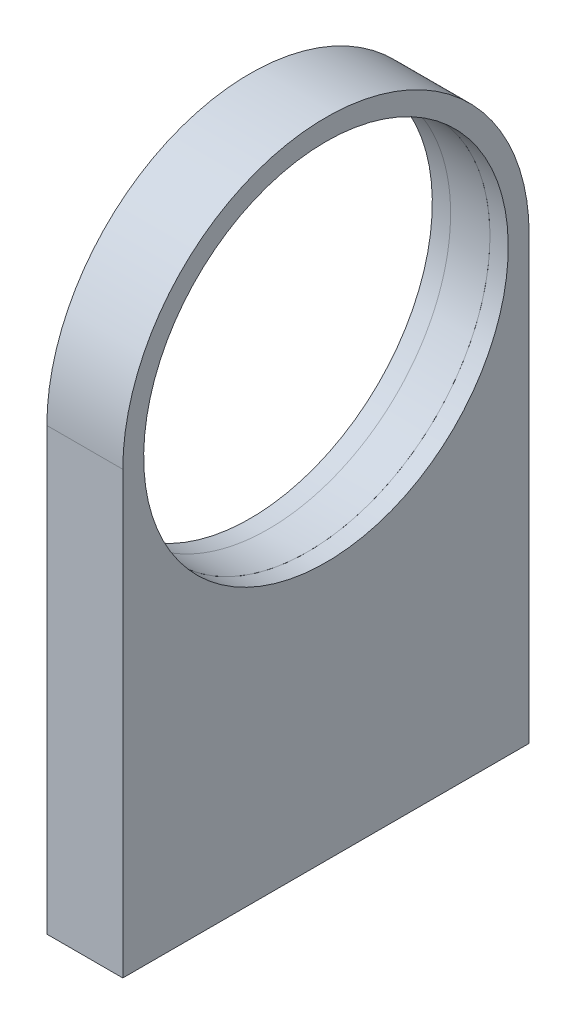
ISO-10303-21;
HEADER;
FILE_DESCRIPTION(('STEP AP214'),'2;1');
FILE_NAME('part.step','',(''),(''),'','','');
FILE_SCHEMA(('AUTOMOTIVE_DESIGN { 1 0 10303 214 1 1 1 1 }'));
ENDSEC;
DATA;
#1=APPLICATION_CONTEXT('core data for automotive mechanical design processes');
#2=APPLICATION_PROTOCOL_DEFINITION('international standard','automotive_design',2000,#1);
#3=PRODUCT_CONTEXT('',#1,'mechanical');
#4=PRODUCT('Part','Part','',(#3));
#5=PRODUCT_RELATED_PRODUCT_CATEGORY('part','',(#4));
#6=PRODUCT_DEFINITION_FORMATION('','',#4);
#7=PRODUCT_DEFINITION_CONTEXT('part definition',#1,'design');
#8=PRODUCT_DEFINITION('design','',#6,#7);
#9=PRODUCT_DEFINITION_SHAPE('','',#8);
#10=(LENGTH_UNIT() NAMED_UNIT(*) SI_UNIT(.MILLI.,.METRE.));
#11=(NAMED_UNIT(*) PLANE_ANGLE_UNIT() SI_UNIT($,.RADIAN.));
#12=(NAMED_UNIT(*) SI_UNIT($,.STERADIAN.) SOLID_ANGLE_UNIT());
#13=UNCERTAINTY_MEASURE_WITH_UNIT(LENGTH_MEASURE(1.E-05),#10,'distance_accuracy_value','');
#14=(GEOMETRIC_REPRESENTATION_CONTEXT(3) GLOBAL_UNCERTAINTY_ASSIGNED_CONTEXT((#13)) GLOBAL_UNIT_ASSIGNED_CONTEXT((#10,
#11,#12)) REPRESENTATION_CONTEXT('',''));
#15=CARTESIAN_POINT('',(0.,0.,0.));
#16=DIRECTION('',(0.,0.,1.));
#17=DIRECTION('',(1.,0.,0.));
#18=AXIS2_PLACEMENT_3D('',#15,#16,#17);
#19=CARTESIAN_POINT('',(-83.110941126336,88.0207363520948,0.));
#20=DIRECTION('',(-1.,0.,0.));
#21=DIRECTION('',(0.,-1.,0.));
#22=AXIS2_PLACEMENT_3D('',#19,#20,#21);
#23=PLANE('',#22);
#24=CARTESIAN_POINT('',(-83.110941126336,0.,0.));
#25=DIRECTION('',(-1.,0.,0.));
#26=DIRECTION('',(0.,-1.,0.));
#27=AXIS2_PLACEMENT_3D('',#24,#25,#26);
#28=CIRCLE('',#27,96.);
#29=CARTESIAN_POINT('',(-83.110941126336,-96.,0.));
#30=VERTEX_POINT('',#29);
#31=EDGE_CURVE('E104',#30,#30,#28,.T.);
#32=ORIENTED_EDGE('',*,*,#31,.F.);
#33=EDGE_LOOP('',(#32));
#34=FACE_BOUND('',#33,.T.);
#35=CARTESIAN_POINT('',(-83.110941126336,0.,0.));
#36=DIRECTION('',(1.,0.,0.));
#37=DIRECTION('',(0.,1.,0.));
#38=AXIS2_PLACEMENT_3D('',#35,#36,#37);
#39=CIRCLE('',#38,96.0207363520948);
#40=CARTESIAN_POINT('',(-83.110941126336,96.0207363520948,0.));
#41=VERTEX_POINT('',#40);
#42=EDGE_CURVE('E11',#41,#41,#39,.T.);
#43=ORIENTED_EDGE('',*,*,#42,.F.);
#44=EDGE_LOOP('',(#43));
#45=FACE_BOUND('',#44,.T.);
#46=ADVANCED_FACE('F38',(#34,#45),#23,.T.);
#47=CARTESIAN_POINT('',(0.,0.,0.));
#48=DIRECTION('',(1.,0.,0.));
#49=DIRECTION('',(0.,1.,0.));
#50=AXIS2_PLACEMENT_3D('',#47,#48,#49);
#51=CYLINDRICAL_SURFACE('',#50,96.0207363520948);
#52=ORIENTED_EDGE('',*,*,#42,.T.);
#53=EDGE_LOOP('',(#52));
#54=FACE_BOUND('',#53,.T.);
#55=CARTESIAN_POINT('',(-92.7398937052333,0.,0.));
#56=DIRECTION('',(1.,0.,0.));
#57=DIRECTION('',(0.,1.,0.));
#58=AXIS2_PLACEMENT_3D('',#55,#56,#57);
#59=CIRCLE('',#58,96.0207363520948);
#60=CARTESIAN_POINT('',(-92.7398937052333,96.0207363520948,0.));
#61=VERTEX_POINT('',#60);
#62=EDGE_CURVE('E46',#61,#61,#59,.T.);
#63=ORIENTED_EDGE('',*,*,#62,.F.);
#64=EDGE_LOOP('',(#63));
#65=FACE_BOUND('',#64,.T.);
#66=ADVANCED_FACE('F130',(#54,#65),#51,.F.);
#67=CARTESIAN_POINT('',(-92.7398937052333,96.0207363520948,0.));
#68=DIRECTION('',(-1.,0.,0.));
#69=DIRECTION('',(0.,-1.,0.));
#70=AXIS2_PLACEMENT_3D('',#67,#68,#69);
#71=PLANE('',#70);
#72=ORIENTED_EDGE('',*,*,#62,.T.);
#73=EDGE_LOOP('',(#72));
#74=FACE_BOUND('',#73,.T.);
#75=CARTESIAN_POINT('',(-92.7398937052333,0.,0.));
#76=DIRECTION('',(1.,0.,0.));
#77=DIRECTION('',(0.,1.,0.));
#78=AXIS2_PLACEMENT_3D('',#75,#76,#77);
#79=CIRCLE('',#78,107.020736352095);
#80=CARTESIAN_POINT('',(-92.7398937052333,0.,-107.020736352095));
#81=VERTEX_POINT('',#80);
#82=CARTESIAN_POINT('',(-92.7398937052333,0.,107.020736352095));
#83=VERTEX_POINT('',#82);
#84=EDGE_CURVE('E121',#81,#83,#79,.T.);
#85=ORIENTED_EDGE('',*,*,#84,.F.);
#86=DIRECTION('',(0.,-1.,0.));
#87=VECTOR('',#86,1.);
#88=CARTESIAN_POINT('',(-92.7398937052333,0.,-107.020736352095));
#89=LINE('',#88,#87);
#90=CARTESIAN_POINT('',(-92.7398937052333,-232.057883899355,-107.020736352095));
#91=VERTEX_POINT('',#90);
#92=EDGE_CURVE('E107',#81,#91,#89,.T.);
#93=ORIENTED_EDGE('',*,*,#92,.T.);
#94=DIRECTION('',(0.,0.,1.));
#95=VECTOR('',#94,1.);
#96=CARTESIAN_POINT('',(-92.7398937052333,-232.057883899355,0.));
#97=LINE('',#96,#95);
#98=CARTESIAN_POINT('',(-92.7398937052333,-232.057883899355,107.020736352095));
#99=VERTEX_POINT('',#98);
#100=EDGE_CURVE('E88',#91,#99,#97,.T.);
#101=ORIENTED_EDGE('',*,*,#100,.T.);
#102=DIRECTION('',(0.,1.,0.));
#103=VECTOR('',#102,1.);
#104=CARTESIAN_POINT('',(-92.7398937052333,0.,107.020736352095));
#105=LINE('',#104,#103);
#106=EDGE_CURVE('E100',#99,#83,#105,.T.);
#107=ORIENTED_EDGE('',*,*,#106,.T.);
#108=EDGE_LOOP('',(#85,#93,#101,#107));
#109=FACE_BOUND('',#108,.T.);
#110=ADVANCED_FACE('F127',(#74,#109),#71,.T.);
#111=CARTESIAN_POINT('',(0.,0.,0.));
#112=DIRECTION('',(1.,0.,0.));
#113=DIRECTION('',(0.,1.,0.));
#114=AXIS2_PLACEMENT_3D('',#111,#112,#113);
#115=CYLINDRICAL_SURFACE('',#114,107.020736352095);
#116=DIRECTION('',(-1.,0.,0.));
#117=VECTOR('',#116,1.);
#118=CARTESIAN_POINT('',(-52.7398937052333,0.,107.020736352095));
#119=LINE('',#118,#117);
#120=CARTESIAN_POINT('',(-52.7398937052333,0.,107.020736352095));
#121=VERTEX_POINT('',#120);
#122=EDGE_CURVE('E78',#121,#83,#119,.T.);
#123=ORIENTED_EDGE('',*,*,#122,.F.);
#124=CARTESIAN_POINT('',(-52.7398937052333,0.,0.));
#125=DIRECTION('',(1.,0.,0.));
#126=DIRECTION('',(0.,1.,0.));
#127=AXIS2_PLACEMENT_3D('',#124,#125,#126);
#128=CIRCLE('',#127,107.020736352095);
#129=CARTESIAN_POINT('',(-52.7398937052333,0.,-107.020736352095));
#130=VERTEX_POINT('',#129);
#131=EDGE_CURVE('E119',#130,#121,#128,.T.);
#132=ORIENTED_EDGE('',*,*,#131,.F.);
#133=DIRECTION('',(-1.,0.,0.));
#134=VECTOR('',#133,1.);
#135=CARTESIAN_POINT('',(-52.7398937052333,0.,-107.020736352095));
#136=LINE('',#135,#134);
#137=EDGE_CURVE('E92',#130,#81,#136,.T.);
#138=ORIENTED_EDGE('',*,*,#137,.T.);
#139=ORIENTED_EDGE('',*,*,#84,.T.);
#140=EDGE_LOOP('',(#123,#132,#138,#139));
#141=FACE_BOUND('',#140,.T.);
#142=ADVANCED_FACE('F137',(#141),#115,.T.);
#143=CARTESIAN_POINT('',(-52.7398937052333,96.0207363520948,0.));
#144=DIRECTION('',(1.,0.,0.));
#145=DIRECTION('',(0.,1.,0.));
#146=AXIS2_PLACEMENT_3D('',#143,#144,#145);
#147=PLANE('',#146);
#148=ORIENTED_EDGE('',*,*,#131,.T.);
#149=DIRECTION('',(0.,1.,0.));
#150=VECTOR('',#149,1.);
#151=CARTESIAN_POINT('',(-52.7398937052333,0.,107.020736352095));
#152=LINE('',#151,#150);
#153=CARTESIAN_POINT('',(-52.7398937052333,-232.057883899355,107.020736352095));
#154=VERTEX_POINT('',#153);
#155=EDGE_CURVE('E62',#154,#121,#152,.T.);
#156=ORIENTED_EDGE('',*,*,#155,.F.);
#157=DIRECTION('',(0.,0.,1.));
#158=VECTOR('',#157,1.);
#159=CARTESIAN_POINT('',(-52.7398937052333,-232.057883899355,0.));
#160=LINE('',#159,#158);
#161=CARTESIAN_POINT('',(-52.7398937052333,-232.057883899355,-107.020736352095));
#162=VERTEX_POINT('',#161);
#163=EDGE_CURVE('E86',#162,#154,#160,.T.);
#164=ORIENTED_EDGE('',*,*,#163,.F.);
#165=DIRECTION('',(0.,-1.,0.));
#166=VECTOR('',#165,1.);
#167=CARTESIAN_POINT('',(-52.7398937052333,0.,-107.020736352095));
#168=LINE('',#167,#166);
#169=EDGE_CURVE('E53',#130,#162,#168,.T.);
#170=ORIENTED_EDGE('',*,*,#169,.F.);
#171=EDGE_LOOP('',(#148,#156,#164,#170));
#172=FACE_BOUND('',#171,.T.);
#173=CARTESIAN_POINT('',(-52.7398937052333,0.,0.));
#174=DIRECTION('',(1.,0.,0.));
#175=DIRECTION('',(0.,1.,0.));
#176=AXIS2_PLACEMENT_3D('',#173,#174,#175);
#177=CIRCLE('',#176,96.0207363520948);
#178=CARTESIAN_POINT('',(-52.7398937052333,96.0207363520948,0.));
#179=VERTEX_POINT('',#178);
#180=EDGE_CURVE('E116',#179,#179,#177,.T.);
#181=ORIENTED_EDGE('',*,*,#180,.F.);
#182=EDGE_LOOP('',(#181));
#183=FACE_BOUND('',#182,.T.);
#184=ADVANCED_FACE('F94',(#172,#183),#147,.T.);
#185=CARTESIAN_POINT('',(0.,0.,0.));
#186=DIRECTION('',(1.,0.,0.));
#187=DIRECTION('',(0.,1.,0.));
#188=AXIS2_PLACEMENT_3D('',#185,#186,#187);
#189=CYLINDRICAL_SURFACE('',#188,96.0207363520948);
#190=ORIENTED_EDGE('',*,*,#180,.T.);
#191=EDGE_LOOP('',(#190));
#192=FACE_BOUND('',#191,.T.);
#193=CARTESIAN_POINT('',(-62.3688462841307,0.,0.));
#194=DIRECTION('',(1.,0.,0.));
#195=DIRECTION('',(0.,1.,0.));
#196=AXIS2_PLACEMENT_3D('',#193,#194,#195);
#197=CIRCLE('',#196,96.0207363520948);
#198=CARTESIAN_POINT('',(-62.3688462841307,96.0207363520948,0.));
#199=VERTEX_POINT('',#198);
#200=EDGE_CURVE('E111',#199,#199,#197,.T.);
#201=ORIENTED_EDGE('',*,*,#200,.F.);
#202=EDGE_LOOP('',(#201));
#203=FACE_BOUND('',#202,.T.);
#204=ADVANCED_FACE('F146',(#192,#203),#189,.F.);
#205=CARTESIAN_POINT('',(-62.3688462841307,88.0207363520948,0.));
#206=DIRECTION('',(1.,0.,0.));
#207=DIRECTION('',(0.,1.,0.));
#208=AXIS2_PLACEMENT_3D('',#205,#206,#207);
#209=PLANE('',#208);
#210=CARTESIAN_POINT('',(-62.3688462841307,0.,0.));
#211=DIRECTION('',(1.,0.,0.));
#212=DIRECTION('',(0.,1.,0.));
#213=AXIS2_PLACEMENT_3D('',#210,#211,#212);
#214=CIRCLE('',#213,96.);
#215=CARTESIAN_POINT('',(-62.3688462841307,96.,0.));
#216=VERTEX_POINT('',#215);
#217=EDGE_CURVE('E41',#216,#216,#214,.T.);
#218=ORIENTED_EDGE('',*,*,#217,.F.);
#219=EDGE_LOOP('',(#218));
#220=FACE_BOUND('',#219,.T.);
#221=ORIENTED_EDGE('',*,*,#200,.T.);
#222=EDGE_LOOP('',(#221));
#223=FACE_BOUND('',#222,.T.);
#224=ADVANCED_FACE('F149',(#220,#223),#209,.T.);
#225=CARTESIAN_POINT('',(-52.7398937052333,0.,107.020736352095));
#226=DIRECTION('',(0.,0.,1.));
#227=DIRECTION('',(1.,0.,0.));
#228=AXIS2_PLACEMENT_3D('',#225,#226,#227);
#229=PLANE('',#228);
#230=ORIENTED_EDGE('',*,*,#106,.F.);
#231=DIRECTION('',(-1.,0.,0.));
#232=VECTOR('',#231,1.);
#233=CARTESIAN_POINT('',(-52.7398937052333,-232.057883899355,107.020736352095));
#234=LINE('',#233,#232);
#235=EDGE_CURVE('E91',#154,#99,#234,.T.);
#236=ORIENTED_EDGE('',*,*,#235,.F.);
#237=ORIENTED_EDGE('',*,*,#155,.T.);
#238=ORIENTED_EDGE('',*,*,#122,.T.);
#239=EDGE_LOOP('',(#230,#236,#237,#238));
#240=FACE_BOUND('',#239,.T.);
#241=ADVANCED_FACE('F153',(#240),#229,.T.);
#242=CARTESIAN_POINT('',(-52.7398937052333,-232.057883899355,0.));
#243=DIRECTION('',(0.,-1.,0.));
#244=DIRECTION('',(1.,0.,0.));
#245=AXIS2_PLACEMENT_3D('',#242,#243,#244);
#246=PLANE('',#245);
#247=ORIENTED_EDGE('',*,*,#100,.F.);
#248=DIRECTION('',(-1.,0.,0.));
#249=VECTOR('',#248,1.);
#250=CARTESIAN_POINT('',(-52.7398937052333,-232.057883899355,-107.020736352095));
#251=LINE('',#250,#249);
#252=EDGE_CURVE('E84',#162,#91,#251,.T.);
#253=ORIENTED_EDGE('',*,*,#252,.F.);
#254=ORIENTED_EDGE('',*,*,#163,.T.);
#255=ORIENTED_EDGE('',*,*,#235,.T.);
#256=EDGE_LOOP('',(#247,#253,#254,#255));
#257=FACE_BOUND('',#256,.T.);
#258=ADVANCED_FACE('F85',(#257),#246,.T.);
#259=CARTESIAN_POINT('',(-52.7398937052333,0.,-107.020736352095));
#260=DIRECTION('',(0.,0.,-1.));
#261=DIRECTION('',(-1.,0.,0.));
#262=AXIS2_PLACEMENT_3D('',#259,#260,#261);
#263=PLANE('',#262);
#264=ORIENTED_EDGE('',*,*,#92,.F.);
#265=ORIENTED_EDGE('',*,*,#137,.F.);
#266=ORIENTED_EDGE('',*,*,#169,.T.);
#267=ORIENTED_EDGE('',*,*,#252,.T.);
#268=EDGE_LOOP('',(#264,#265,#266,#267));
#269=FACE_BOUND('',#268,.T.);
#270=ADVANCED_FACE('F97',(#269),#263,.T.);
#271=CARTESIAN_POINT('',(-52.7398937052333,0.,0.));
#272=DIRECTION('',(-1.,0.,0.));
#273=DIRECTION('',(0.,-1.,0.));
#274=AXIS2_PLACEMENT_3D('',#271,#272,#273);
#275=CYLINDRICAL_SURFACE('',#274,96.);
#276=ORIENTED_EDGE('',*,*,#31,.T.);
#277=EDGE_LOOP('',(#276));
#278=FACE_BOUND('',#277,.T.);
#279=ORIENTED_EDGE('',*,*,#217,.T.);
#280=EDGE_LOOP('',(#279));
#281=FACE_BOUND('',#280,.T.);
#282=ADVANCED_FACE('F157',(#278,#281),#275,.F.);
#283=CLOSED_SHELL('',(#46,#66,#110,#142,#184,#204,#224,#241,#258,#270,#282));
#284=MANIFOLD_SOLID_BREP('B2',#283);
#285=ADVANCED_BREP_SHAPE_REPRESENTATION('',(#18,#284),#14);
#286=SHAPE_DEFINITION_REPRESENTATION(#9,#285);
ENDSEC;
END-ISO-10303-21;
